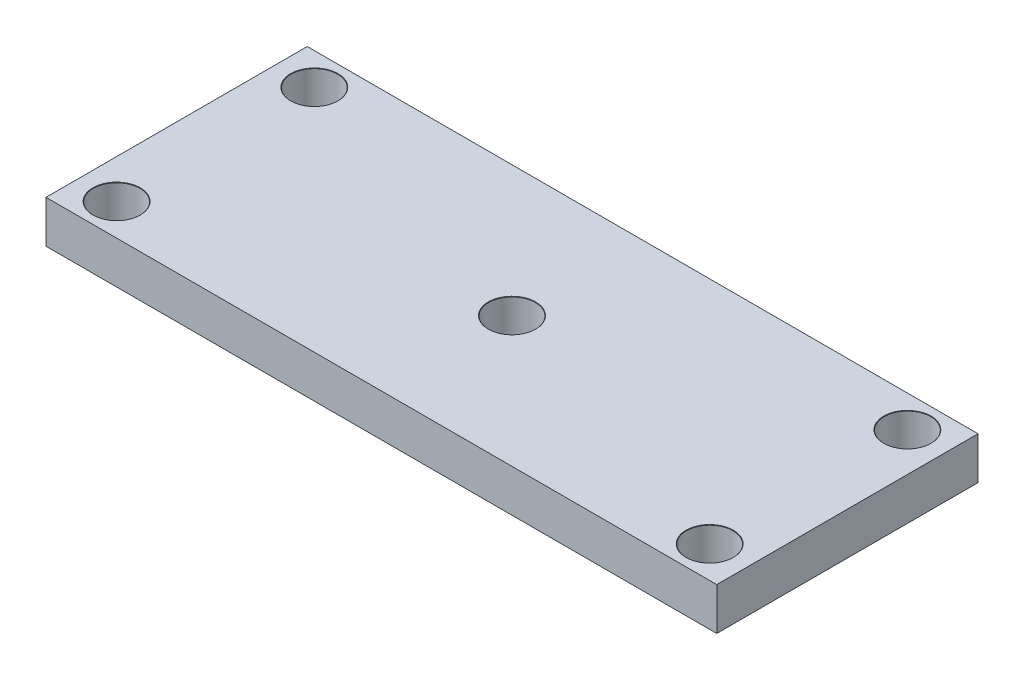
ISO-10303-21;
HEADER;
FILE_DESCRIPTION(('STEP AP214'),'2;1');
FILE_NAME('part.step','',(''),(''),'','','');
FILE_SCHEMA(('AUTOMOTIVE_DESIGN { 1 0 10303 214 1 1 1 1 }'));
ENDSEC;
DATA;
#1=APPLICATION_CONTEXT('core data for automotive mechanical design processes');
#2=APPLICATION_PROTOCOL_DEFINITION('international standard','automotive_design',2000,#1);
#3=PRODUCT_CONTEXT('',#1,'mechanical');
#4=PRODUCT('Part','Part','',(#3));
#5=PRODUCT_RELATED_PRODUCT_CATEGORY('part','',(#4));
#6=PRODUCT_DEFINITION_FORMATION('','',#4);
#7=PRODUCT_DEFINITION_CONTEXT('part definition',#1,'design');
#8=PRODUCT_DEFINITION('design','',#6,#7);
#9=PRODUCT_DEFINITION_SHAPE('','',#8);
#10=(LENGTH_UNIT() NAMED_UNIT(*) SI_UNIT(.MILLI.,.METRE.));
#11=(NAMED_UNIT(*) PLANE_ANGLE_UNIT() SI_UNIT($,.RADIAN.));
#12=(NAMED_UNIT(*) SI_UNIT($,.STERADIAN.) SOLID_ANGLE_UNIT());
#13=UNCERTAINTY_MEASURE_WITH_UNIT(LENGTH_MEASURE(1.E-05),#10,'distance_accuracy_value','');
#14=(GEOMETRIC_REPRESENTATION_CONTEXT(3) GLOBAL_UNCERTAINTY_ASSIGNED_CONTEXT((#13)) GLOBAL_UNIT_ASSIGNED_CONTEXT((#10,
#11,#12)) REPRESENTATION_CONTEXT('',''));
#15=CARTESIAN_POINT('',(0.,0.,0.));
#16=DIRECTION('',(0.,0.,1.));
#17=DIRECTION('',(1.,0.,0.));
#18=AXIS2_PLACEMENT_3D('',#15,#16,#17);
#19=CARTESIAN_POINT('',(23.75,3.,-9.25));
#20=DIRECTION('',(-1.,0.,0.));
#21=DIRECTION('',(0.,0.,1.));
#22=AXIS2_PLACEMENT_3D('',#19,#20,#21);
#23=PLANE('',#22);
#24=DIRECTION('',(0.,0.,-1.));
#25=VECTOR('',#24,1.);
#26=CARTESIAN_POINT('',(23.75,0.,-9.25));
#27=LINE('',#26,#25);
#28=CARTESIAN_POINT('',(23.75,0.,9.25));
#29=VERTEX_POINT('',#28);
#30=CARTESIAN_POINT('',(23.75,0.,-9.25));
#31=VERTEX_POINT('',#30);
#32=EDGE_CURVE('E96',#29,#31,#27,.T.);
#33=ORIENTED_EDGE('',*,*,#32,.T.);
#34=DIRECTION('',(0.,-1.,0.));
#35=VECTOR('',#34,1.);
#36=CARTESIAN_POINT('',(23.75,3.,-9.25));
#37=LINE('',#36,#35);
#38=CARTESIAN_POINT('',(23.75,3.,-9.25));
#39=VERTEX_POINT('',#38);
#40=EDGE_CURVE('E11',#39,#31,#37,.T.);
#41=ORIENTED_EDGE('',*,*,#40,.F.);
#42=DIRECTION('',(0.,0.,-1.));
#43=VECTOR('',#42,1.);
#44=CARTESIAN_POINT('',(23.75,3.,-9.25));
#45=LINE('',#44,#43);
#46=CARTESIAN_POINT('',(23.75,3.,9.25));
#47=VERTEX_POINT('',#46);
#48=EDGE_CURVE('E84',#47,#39,#45,.T.);
#49=ORIENTED_EDGE('',*,*,#48,.F.);
#50=DIRECTION('',(0.,-1.,0.));
#51=VECTOR('',#50,1.);
#52=CARTESIAN_POINT('',(23.75,3.,9.25));
#53=LINE('',#52,#51);
#54=EDGE_CURVE('E92',#47,#29,#53,.T.);
#55=ORIENTED_EDGE('',*,*,#54,.T.);
#56=EDGE_LOOP('',(#33,#41,#49,#55));
#57=FACE_BOUND('',#56,.T.);
#58=ADVANCED_FACE('F33',(#57),#23,.F.);
#59=CARTESIAN_POINT('',(-23.75,3.,-9.25));
#60=DIRECTION('',(0.,0.,1.));
#61=DIRECTION('',(1.,0.,0.));
#62=AXIS2_PLACEMENT_3D('',#59,#60,#61);
#63=PLANE('',#62);
#64=DIRECTION('',(-1.,0.,0.));
#65=VECTOR('',#64,1.);
#66=CARTESIAN_POINT('',(-23.75,0.,-9.25));
#67=LINE('',#66,#65);
#68=CARTESIAN_POINT('',(-23.75,0.,-9.25));
#69=VERTEX_POINT('',#68);
#70=EDGE_CURVE('E88',#31,#69,#67,.T.);
#71=ORIENTED_EDGE('',*,*,#70,.T.);
#72=DIRECTION('',(0.,-1.,0.));
#73=VECTOR('',#72,1.);
#74=CARTESIAN_POINT('',(-23.75,3.,-9.25));
#75=LINE('',#74,#73);
#76=CARTESIAN_POINT('',(-23.75,3.,-9.25));
#77=VERTEX_POINT('',#76);
#78=EDGE_CURVE('E41',#77,#69,#75,.T.);
#79=ORIENTED_EDGE('',*,*,#78,.F.);
#80=DIRECTION('',(-1.,0.,0.));
#81=VECTOR('',#80,1.);
#82=CARTESIAN_POINT('',(-23.75,3.,-9.25));
#83=LINE('',#82,#81);
#84=EDGE_CURVE('E79',#39,#77,#83,.T.);
#85=ORIENTED_EDGE('',*,*,#84,.F.);
#86=ORIENTED_EDGE('',*,*,#40,.T.);
#87=EDGE_LOOP('',(#71,#79,#85,#86));
#88=FACE_BOUND('',#87,.T.);
#89=ADVANCED_FACE('F87',(#88),#63,.F.);
#90=CARTESIAN_POINT('',(-23.75,3.,-9.25));
#91=DIRECTION('',(1.,0.,0.));
#92=DIRECTION('',(0.,0.,-1.));
#93=AXIS2_PLACEMENT_3D('',#90,#91,#92);
#94=PLANE('',#93);
#95=DIRECTION('',(0.,0.,1.));
#96=VECTOR('',#95,1.);
#97=CARTESIAN_POINT('',(-23.75,0.,-9.25));
#98=LINE('',#97,#96);
#99=CARTESIAN_POINT('',(-23.75,0.,9.25));
#100=VERTEX_POINT('',#99);
#101=EDGE_CURVE('E66',#69,#100,#98,.T.);
#102=ORIENTED_EDGE('',*,*,#101,.T.);
#103=DIRECTION('',(0.,-1.,0.));
#104=VECTOR('',#103,1.);
#105=CARTESIAN_POINT('',(-23.75,3.,9.25));
#106=LINE('',#105,#104);
#107=CARTESIAN_POINT('',(-23.75,3.,9.25));
#108=VERTEX_POINT('',#107);
#109=EDGE_CURVE('E89',#108,#100,#106,.T.);
#110=ORIENTED_EDGE('',*,*,#109,.F.);
#111=DIRECTION('',(0.,0.,1.));
#112=VECTOR('',#111,1.);
#113=CARTESIAN_POINT('',(-23.75,3.,-9.25));
#114=LINE('',#113,#112);
#115=EDGE_CURVE('E82',#77,#108,#114,.T.);
#116=ORIENTED_EDGE('',*,*,#115,.F.);
#117=ORIENTED_EDGE('',*,*,#78,.T.);
#118=EDGE_LOOP('',(#102,#110,#116,#117));
#119=FACE_BOUND('',#118,.T.);
#120=ADVANCED_FACE('F90',(#119),#94,.F.);
#121=CARTESIAN_POINT('',(-23.75,3.,9.25));
#122=DIRECTION('',(0.,0.,-1.));
#123=DIRECTION('',(-1.,0.,0.));
#124=AXIS2_PLACEMENT_3D('',#121,#122,#123);
#125=PLANE('',#124);
#126=DIRECTION('',(1.,0.,0.));
#127=VECTOR('',#126,1.);
#128=CARTESIAN_POINT('',(-23.75,0.,9.25));
#129=LINE('',#128,#127);
#130=EDGE_CURVE('E72',#100,#29,#129,.T.);
#131=ORIENTED_EDGE('',*,*,#130,.T.);
#132=ORIENTED_EDGE('',*,*,#54,.F.);
#133=DIRECTION('',(1.,0.,0.));
#134=VECTOR('',#133,1.);
#135=CARTESIAN_POINT('',(-23.75,3.,9.25));
#136=LINE('',#135,#134);
#137=EDGE_CURVE('E49',#108,#47,#136,.T.);
#138=ORIENTED_EDGE('',*,*,#137,.F.);
#139=ORIENTED_EDGE('',*,*,#109,.T.);
#140=EDGE_LOOP('',(#131,#132,#138,#139));
#141=FACE_BOUND('',#140,.T.);
#142=ADVANCED_FACE('F104',(#141),#125,.F.);
#143=CARTESIAN_POINT('',(0.,3.,0.));
#144=DIRECTION('',(0.,1.,0.));
#145=DIRECTION('',(0.,0.,1.));
#146=AXIS2_PLACEMENT_3D('',#143,#144,#145);
#147=PLANE('',#146);
#148=CARTESIAN_POINT('',(0.,3.,0.));
#149=DIRECTION('',(0.,1.,0.));
#150=DIRECTION('',(0.,0.,1.));
#151=AXIS2_PLACEMENT_3D('',#148,#149,#150);
#152=CIRCLE('',#151,1.675);
#153=CARTESIAN_POINT('',(0.,3.,1.675));
#154=VERTEX_POINT('',#153);
#155=EDGE_CURVE('E151',#154,#154,#152,.T.);
#156=ORIENTED_EDGE('',*,*,#155,.F.);
#157=EDGE_LOOP('',(#156));
#158=FACE_BOUND('',#157,.T.);
#159=CARTESIAN_POINT('',(21.,3.,7.));
#160=DIRECTION('',(0.,1.,0.));
#161=DIRECTION('',(0.,0.,1.));
#162=AXIS2_PLACEMENT_3D('',#159,#160,#161);
#163=CIRCLE('',#162,1.675);
#164=CARTESIAN_POINT('',(21.,3.,8.675));
#165=VERTEX_POINT('',#164);
#166=EDGE_CURVE('E142',#165,#165,#163,.T.);
#167=ORIENTED_EDGE('',*,*,#166,.F.);
#168=EDGE_LOOP('',(#167));
#169=FACE_BOUND('',#168,.T.);
#170=CARTESIAN_POINT('',(-21.,3.,-7.));
#171=DIRECTION('',(0.,1.,0.));
#172=DIRECTION('',(0.,0.,1.));
#173=AXIS2_PLACEMENT_3D('',#170,#171,#172);
#174=CIRCLE('',#173,1.675);
#175=CARTESIAN_POINT('',(-21.,3.,-5.325));
#176=VERTEX_POINT('',#175);
#177=EDGE_CURVE('E133',#176,#176,#174,.T.);
#178=ORIENTED_EDGE('',*,*,#177,.F.);
#179=EDGE_LOOP('',(#178));
#180=FACE_BOUND('',#179,.T.);
#181=CARTESIAN_POINT('',(-21.,3.,7.));
#182=DIRECTION('',(0.,1.,0.));
#183=DIRECTION('',(0.,0.,1.));
#184=AXIS2_PLACEMENT_3D('',#181,#182,#183);
#185=CIRCLE('',#184,1.675);
#186=CARTESIAN_POINT('',(-21.,3.,8.675));
#187=VERTEX_POINT('',#186);
#188=EDGE_CURVE('E124',#187,#187,#185,.T.);
#189=ORIENTED_EDGE('',*,*,#188,.F.);
#190=EDGE_LOOP('',(#189));
#191=FACE_BOUND('',#190,.T.);
#192=CARTESIAN_POINT('',(21.,3.,-7.));
#193=DIRECTION('',(0.,1.,0.));
#194=DIRECTION('',(0.,0.,1.));
#195=AXIS2_PLACEMENT_3D('',#192,#193,#194);
#196=CIRCLE('',#195,1.675);
#197=CARTESIAN_POINT('',(21.,3.,-5.325));
#198=VERTEX_POINT('',#197);
#199=EDGE_CURVE('E115',#198,#198,#196,.T.);
#200=ORIENTED_EDGE('',*,*,#199,.F.);
#201=EDGE_LOOP('',(#200));
#202=FACE_BOUND('',#201,.T.);
#203=ORIENTED_EDGE('',*,*,#48,.T.);
#204=ORIENTED_EDGE('',*,*,#84,.T.);
#205=ORIENTED_EDGE('',*,*,#115,.T.);
#206=ORIENTED_EDGE('',*,*,#137,.T.);
#207=EDGE_LOOP('',(#203,#204,#205,#206));
#208=FACE_BOUND('',#207,.T.);
#209=ADVANCED_FACE('F80',(#158,#169,#180,#191,#202,#208),#147,.T.);
#210=CARTESIAN_POINT('',(0.,0.,0.));
#211=DIRECTION('',(0.,1.,0.));
#212=DIRECTION('',(0.,0.,1.));
#213=AXIS2_PLACEMENT_3D('',#210,#211,#212);
#214=PLANE('',#213);
#215=CARTESIAN_POINT('',(0.,0.,0.));
#216=DIRECTION('',(0.,1.,0.));
#217=DIRECTION('',(0.,0.,1.));
#218=AXIS2_PLACEMENT_3D('',#215,#216,#217);
#219=CIRCLE('',#218,1.65);
#220=CARTESIAN_POINT('',(0.,0.,1.65));
#221=VERTEX_POINT('',#220);
#222=EDGE_CURVE('E145',#221,#221,#219,.T.);
#223=ORIENTED_EDGE('',*,*,#222,.T.);
#224=EDGE_LOOP('',(#223));
#225=FACE_BOUND('',#224,.T.);
#226=CARTESIAN_POINT('',(21.,0.,7.));
#227=DIRECTION('',(0.,1.,0.));
#228=DIRECTION('',(0.,0.,1.));
#229=AXIS2_PLACEMENT_3D('',#226,#227,#228);
#230=CIRCLE('',#229,1.65);
#231=CARTESIAN_POINT('',(21.,0.,8.65));
#232=VERTEX_POINT('',#231);
#233=EDGE_CURVE('E136',#232,#232,#230,.T.);
#234=ORIENTED_EDGE('',*,*,#233,.T.);
#235=EDGE_LOOP('',(#234));
#236=FACE_BOUND('',#235,.T.);
#237=CARTESIAN_POINT('',(-21.,0.,-7.));
#238=DIRECTION('',(0.,1.,0.));
#239=DIRECTION('',(0.,0.,1.));
#240=AXIS2_PLACEMENT_3D('',#237,#238,#239);
#241=CIRCLE('',#240,1.65);
#242=CARTESIAN_POINT('',(-21.,0.,-5.35));
#243=VERTEX_POINT('',#242);
#244=EDGE_CURVE('E127',#243,#243,#241,.T.);
#245=ORIENTED_EDGE('',*,*,#244,.T.);
#246=EDGE_LOOP('',(#245));
#247=FACE_BOUND('',#246,.T.);
#248=CARTESIAN_POINT('',(-21.,0.,7.));
#249=DIRECTION('',(0.,1.,0.));
#250=DIRECTION('',(0.,0.,1.));
#251=AXIS2_PLACEMENT_3D('',#248,#249,#250);
#252=CIRCLE('',#251,1.65);
#253=CARTESIAN_POINT('',(-21.,0.,8.65));
#254=VERTEX_POINT('',#253);
#255=EDGE_CURVE('E118',#254,#254,#252,.T.);
#256=ORIENTED_EDGE('',*,*,#255,.T.);
#257=EDGE_LOOP('',(#256));
#258=FACE_BOUND('',#257,.T.);
#259=CARTESIAN_POINT('',(21.,0.,-7.));
#260=DIRECTION('',(0.,1.,0.));
#261=DIRECTION('',(0.,0.,1.));
#262=AXIS2_PLACEMENT_3D('',#259,#260,#261);
#263=CIRCLE('',#262,1.65);
#264=CARTESIAN_POINT('',(21.,0.,-5.35));
#265=VERTEX_POINT('',#264);
#266=EDGE_CURVE('E99',#265,#265,#263,.T.);
#267=ORIENTED_EDGE('',*,*,#266,.T.);
#268=EDGE_LOOP('',(#267));
#269=FACE_BOUND('',#268,.T.);
#270=ORIENTED_EDGE('',*,*,#32,.F.);
#271=ORIENTED_EDGE('',*,*,#130,.F.);
#272=ORIENTED_EDGE('',*,*,#101,.F.);
#273=ORIENTED_EDGE('',*,*,#70,.F.);
#274=EDGE_LOOP('',(#270,#271,#272,#273));
#275=FACE_BOUND('',#274,.T.);
#276=ADVANCED_FACE('F107',(#225,#236,#247,#258,#269,#275),#214,.F.);
#277=CARTESIAN_POINT('',(21.,3.,-7.));
#278=DIRECTION('',(0.,1.,0.));
#279=DIRECTION('',(0.,0.,1.));
#280=AXIS2_PLACEMENT_3D('',#277,#278,#279);
#281=CYLINDRICAL_SURFACE('',#280,1.65);
#282=ORIENTED_EDGE('',*,*,#266,.F.);
#283=EDGE_LOOP('',(#282));
#284=FACE_BOUND('',#283,.T.);
#285=CARTESIAN_POINT('',(21.,2.97499999999999,-7.));
#286=DIRECTION('',(0.,1.,0.));
#287=DIRECTION('',(0.,0.,1.));
#288=AXIS2_PLACEMENT_3D('',#285,#286,#287);
#289=CIRCLE('',#288,1.65);
#290=CARTESIAN_POINT('',(21.,2.97499999999999,-5.35));
#291=VERTEX_POINT('',#290);
#292=EDGE_CURVE('E112',#291,#291,#289,.T.);
#293=ORIENTED_EDGE('',*,*,#292,.T.);
#294=EDGE_LOOP('',(#293));
#295=FACE_BOUND('',#294,.T.);
#296=ADVANCED_FACE('F171',(#284,#295),#281,.F.);
#297=CARTESIAN_POINT('',(21.,3.,-7.));
#298=DIRECTION('',(0.,1.,0.));
#299=DIRECTION('',(0.,0.,1.));
#300=AXIS2_PLACEMENT_3D('',#297,#298,#299);
#301=CONICAL_SURFACE('',#300,1.675,0.78539816339731);
#302=ORIENTED_EDGE('',*,*,#292,.F.);
#303=EDGE_LOOP('',(#302));
#304=FACE_BOUND('',#303,.T.);
#305=ORIENTED_EDGE('',*,*,#199,.T.);
#306=EDGE_LOOP('',(#305));
#307=FACE_BOUND('',#306,.T.);
#308=ADVANCED_FACE('F168',(#304,#307),#301,.F.);
#309=CARTESIAN_POINT('',(-21.,3.,7.));
#310=DIRECTION('',(0.,1.,0.));
#311=DIRECTION('',(0.,0.,1.));
#312=AXIS2_PLACEMENT_3D('',#309,#310,#311);
#313=CYLINDRICAL_SURFACE('',#312,1.65);
#314=ORIENTED_EDGE('',*,*,#255,.F.);
#315=EDGE_LOOP('',(#314));
#316=FACE_BOUND('',#315,.T.);
#317=CARTESIAN_POINT('',(-21.,2.97499999999999,7.));
#318=DIRECTION('',(0.,1.,0.));
#319=DIRECTION('',(0.,0.,1.));
#320=AXIS2_PLACEMENT_3D('',#317,#318,#319);
#321=CIRCLE('',#320,1.65);
#322=CARTESIAN_POINT('',(-21.,2.97499999999999,8.65));
#323=VERTEX_POINT('',#322);
#324=EDGE_CURVE('E121',#323,#323,#321,.T.);
#325=ORIENTED_EDGE('',*,*,#324,.T.);
#326=EDGE_LOOP('',(#325));
#327=FACE_BOUND('',#326,.T.);
#328=ADVANCED_FACE('F170',(#316,#327),#313,.F.);
#329=CARTESIAN_POINT('',(-21.,3.,7.));
#330=DIRECTION('',(0.,1.,0.));
#331=DIRECTION('',(0.,0.,1.));
#332=AXIS2_PLACEMENT_3D('',#329,#330,#331);
#333=CONICAL_SURFACE('',#332,1.675,0.78539816339731);
#334=ORIENTED_EDGE('',*,*,#324,.F.);
#335=EDGE_LOOP('',(#334));
#336=FACE_BOUND('',#335,.T.);
#337=ORIENTED_EDGE('',*,*,#188,.T.);
#338=EDGE_LOOP('',(#337));
#339=FACE_BOUND('',#338,.T.);
#340=ADVANCED_FACE('F178',(#336,#339),#333,.F.);
#341=CARTESIAN_POINT('',(-21.,3.,-7.));
#342=DIRECTION('',(0.,1.,0.));
#343=DIRECTION('',(0.,0.,1.));
#344=AXIS2_PLACEMENT_3D('',#341,#342,#343);
#345=CYLINDRICAL_SURFACE('',#344,1.65);
#346=ORIENTED_EDGE('',*,*,#244,.F.);
#347=EDGE_LOOP('',(#346));
#348=FACE_BOUND('',#347,.T.);
#349=CARTESIAN_POINT('',(-21.,2.97499999999999,-7.));
#350=DIRECTION('',(0.,1.,0.));
#351=DIRECTION('',(0.,0.,1.));
#352=AXIS2_PLACEMENT_3D('',#349,#350,#351);
#353=CIRCLE('',#352,1.65);
#354=CARTESIAN_POINT('',(-21.,2.97499999999999,-5.35));
#355=VERTEX_POINT('',#354);
#356=EDGE_CURVE('E130',#355,#355,#353,.T.);
#357=ORIENTED_EDGE('',*,*,#356,.T.);
#358=EDGE_LOOP('',(#357));
#359=FACE_BOUND('',#358,.T.);
#360=ADVANCED_FACE('F214',(#348,#359),#345,.F.);
#361=CARTESIAN_POINT('',(-21.,3.,-7.));
#362=DIRECTION('',(0.,1.,0.));
#363=DIRECTION('',(0.,0.,1.));
#364=AXIS2_PLACEMENT_3D('',#361,#362,#363);
#365=CONICAL_SURFACE('',#364,1.675,0.78539816339731);
#366=ORIENTED_EDGE('',*,*,#356,.F.);
#367=EDGE_LOOP('',(#366));
#368=FACE_BOUND('',#367,.T.);
#369=ORIENTED_EDGE('',*,*,#177,.T.);
#370=EDGE_LOOP('',(#369));
#371=FACE_BOUND('',#370,.T.);
#372=ADVANCED_FACE('F219',(#368,#371),#365,.F.);
#373=CARTESIAN_POINT('',(21.,3.,7.));
#374=DIRECTION('',(0.,1.,0.));
#375=DIRECTION('',(0.,0.,1.));
#376=AXIS2_PLACEMENT_3D('',#373,#374,#375);
#377=CYLINDRICAL_SURFACE('',#376,1.65);
#378=ORIENTED_EDGE('',*,*,#233,.F.);
#379=EDGE_LOOP('',(#378));
#380=FACE_BOUND('',#379,.T.);
#381=CARTESIAN_POINT('',(21.,2.97499999999999,7.));
#382=DIRECTION('',(0.,1.,0.));
#383=DIRECTION('',(0.,0.,1.));
#384=AXIS2_PLACEMENT_3D('',#381,#382,#383);
#385=CIRCLE('',#384,1.65);
#386=CARTESIAN_POINT('',(21.,2.97499999999999,8.65));
#387=VERTEX_POINT('',#386);
#388=EDGE_CURVE('E139',#387,#387,#385,.T.);
#389=ORIENTED_EDGE('',*,*,#388,.T.);
#390=EDGE_LOOP('',(#389));
#391=FACE_BOUND('',#390,.T.);
#392=ADVANCED_FACE('F225',(#380,#391),#377,.F.);
#393=CARTESIAN_POINT('',(21.,3.,7.));
#394=DIRECTION('',(0.,1.,0.));
#395=DIRECTION('',(0.,0.,1.));
#396=AXIS2_PLACEMENT_3D('',#393,#394,#395);
#397=CONICAL_SURFACE('',#396,1.675,0.78539816339731);
#398=ORIENTED_EDGE('',*,*,#388,.F.);
#399=EDGE_LOOP('',(#398));
#400=FACE_BOUND('',#399,.T.);
#401=ORIENTED_EDGE('',*,*,#166,.T.);
#402=EDGE_LOOP('',(#401));
#403=FACE_BOUND('',#402,.T.);
#404=ADVANCED_FACE('F229',(#400,#403),#397,.F.);
#405=CARTESIAN_POINT('',(0.,3.,0.));
#406=DIRECTION('',(0.,1.,0.));
#407=DIRECTION('',(0.,0.,1.));
#408=AXIS2_PLACEMENT_3D('',#405,#406,#407);
#409=CYLINDRICAL_SURFACE('',#408,1.65);
#410=ORIENTED_EDGE('',*,*,#222,.F.);
#411=EDGE_LOOP('',(#410));
#412=FACE_BOUND('',#411,.T.);
#413=CARTESIAN_POINT('',(0.,2.97499999999999,0.));
#414=DIRECTION('',(0.,1.,0.));
#415=DIRECTION('',(0.,0.,1.));
#416=AXIS2_PLACEMENT_3D('',#413,#414,#415);
#417=CIRCLE('',#416,1.65);
#418=CARTESIAN_POINT('',(0.,2.97499999999999,1.65));
#419=VERTEX_POINT('',#418);
#420=EDGE_CURVE('E148',#419,#419,#417,.T.);
#421=ORIENTED_EDGE('',*,*,#420,.T.);
#422=EDGE_LOOP('',(#421));
#423=FACE_BOUND('',#422,.T.);
#424=ADVANCED_FACE('F233',(#412,#423),#409,.F.);
#425=CARTESIAN_POINT('',(0.,3.,0.));
#426=DIRECTION('',(0.,1.,0.));
#427=DIRECTION('',(0.,0.,1.));
#428=AXIS2_PLACEMENT_3D('',#425,#426,#427);
#429=CONICAL_SURFACE('',#428,1.675,0.785398163397314);
#430=ORIENTED_EDGE('',*,*,#420,.F.);
#431=EDGE_LOOP('',(#430));
#432=FACE_BOUND('',#431,.T.);
#433=ORIENTED_EDGE('',*,*,#155,.T.);
#434=EDGE_LOOP('',(#433));
#435=FACE_BOUND('',#434,.T.);
#436=ADVANCED_FACE('F155',(#432,#435),#429,.F.);
#437=CLOSED_SHELL('',(#58,#89,#120,#142,#209,#276,#296,#308,#328,#340,#360,#372,#392,#404,#424,#436));
#438=MANIFOLD_SOLID_BREP('B2',#437);
#439=ADVANCED_BREP_SHAPE_REPRESENTATION('',(#18,#438),#14);
#440=SHAPE_DEFINITION_REPRESENTATION(#9,#439);
ENDSEC;
END-ISO-10303-21;
